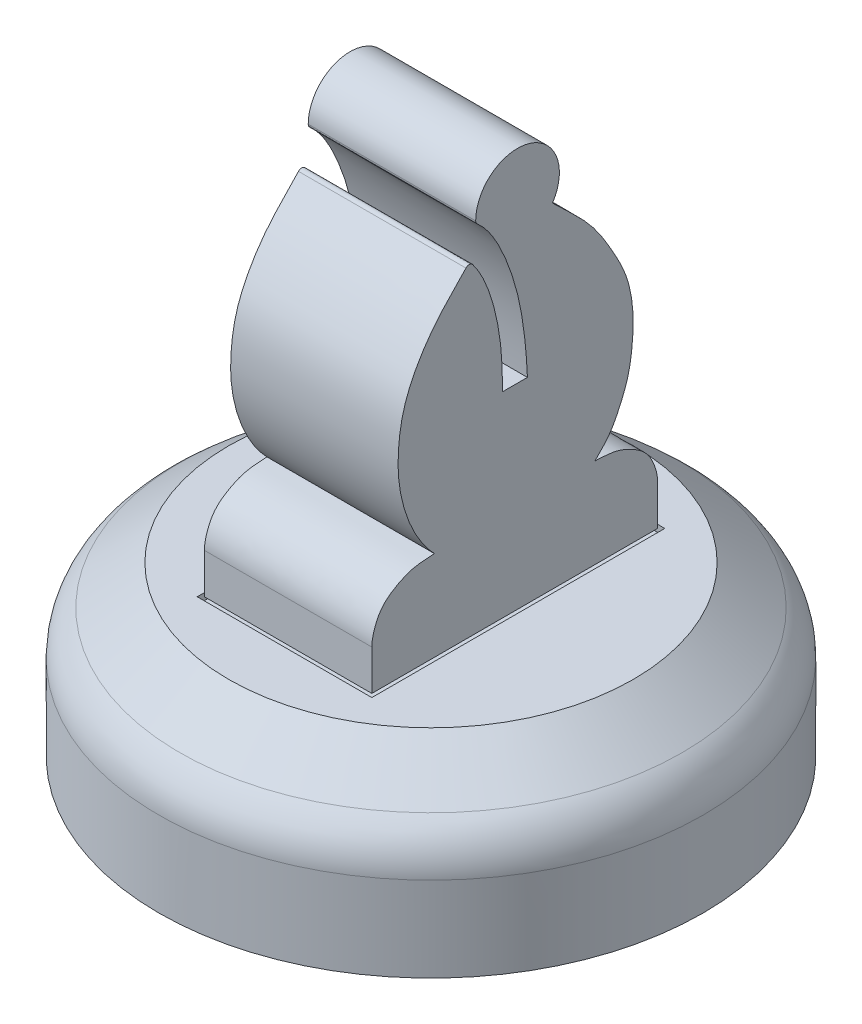
ISO-10303-21;
HEADER;
FILE_DESCRIPTION(('STEP AP214'),'2;1');
FILE_NAME('part.step','',(''),(''),'','','');
FILE_SCHEMA(('AUTOMOTIVE_DESIGN { 1 0 10303 214 1 1 1 1 }'));
ENDSEC;
DATA;
#1=APPLICATION_CONTEXT('core data for automotive mechanical design processes');
#2=APPLICATION_PROTOCOL_DEFINITION('international standard','automotive_design',2000,#1);
#3=PRODUCT_CONTEXT('',#1,'mechanical');
#4=PRODUCT('Part','Part','',(#3));
#5=PRODUCT_RELATED_PRODUCT_CATEGORY('part','',(#4));
#6=PRODUCT_DEFINITION_FORMATION('','',#4);
#7=PRODUCT_DEFINITION_CONTEXT('part definition',#1,'design');
#8=PRODUCT_DEFINITION('design','',#6,#7);
#9=PRODUCT_DEFINITION_SHAPE('','',#8);
#10=(LENGTH_UNIT() NAMED_UNIT(*) SI_UNIT(.MILLI.,.METRE.));
#11=(NAMED_UNIT(*) PLANE_ANGLE_UNIT() SI_UNIT($,.RADIAN.));
#12=(NAMED_UNIT(*) SI_UNIT($,.STERADIAN.) SOLID_ANGLE_UNIT());
#13=UNCERTAINTY_MEASURE_WITH_UNIT(LENGTH_MEASURE(1.E-05),#10,'distance_accuracy_value','');
#14=(GEOMETRIC_REPRESENTATION_CONTEXT(3) GLOBAL_UNCERTAINTY_ASSIGNED_CONTEXT((#13)) GLOBAL_UNIT_ASSIGNED_CONTEXT((#10,
#11,#12)) REPRESENTATION_CONTEXT('',''));
#15=CARTESIAN_POINT('',(0.,0.,0.));
#16=DIRECTION('',(0.,0.,1.));
#17=DIRECTION('',(1.,0.,0.));
#18=AXIS2_PLACEMENT_3D('',#15,#16,#17);
#19=CARTESIAN_POINT('',(4.7625,9.525,-8.128));
#20=DIRECTION('',(0.,0.,1.));
#21=DIRECTION('',(1.,0.,0.));
#22=AXIS2_PLACEMENT_3D('',#19,#20,#21);
#23=PLANE('',#22);
#24=DIRECTION('',(0.,1.,0.));
#25=VECTOR('',#24,1.);
#26=CARTESIAN_POINT('',(-4.7625,9.525,-8.128));
#27=LINE('',#26,#25);
#28=CARTESIAN_POINT('',(-4.7625,9.525,-8.128));
#29=VERTEX_POINT('',#28);
#30=CARTESIAN_POINT('',(-4.7625,11.811,-8.128));
#31=VERTEX_POINT('',#30);
#32=EDGE_CURVE('E165',#29,#31,#27,.T.);
#33=ORIENTED_EDGE('',*,*,#32,.T.);
#34=DIRECTION('',(-1.,0.,0.));
#35=VECTOR('',#34,1.);
#36=CARTESIAN_POINT('',(4.7625,11.811,-8.128));
#37=LINE('',#36,#35);
#38=CARTESIAN_POINT('',(4.7625,11.811,-8.128));
#39=VERTEX_POINT('',#38);
#40=EDGE_CURVE('E146',#39,#31,#37,.T.);
#41=ORIENTED_EDGE('',*,*,#40,.F.);
#42=DIRECTION('',(0.,1.,0.));
#43=VECTOR('',#42,1.);
#44=CARTESIAN_POINT('',(4.7625,9.525,-8.128));
#45=LINE('',#44,#43);
#46=CARTESIAN_POINT('',(4.7625,9.525,-8.128));
#47=VERTEX_POINT('',#46);
#48=EDGE_CURVE('E152',#47,#39,#45,.T.);
#49=ORIENTED_EDGE('',*,*,#48,.F.);
#50=DIRECTION('',(-1.,0.,0.));
#51=VECTOR('',#50,1.);
#52=CARTESIAN_POINT('',(4.7625,9.525,-8.128));
#53=LINE('',#52,#51);
#54=EDGE_CURVE('E221',#47,#29,#53,.T.);
#55=ORIENTED_EDGE('',*,*,#54,.T.);
#56=EDGE_LOOP('',(#33,#41,#49,#55));
#57=FACE_BOUND('',#56,.T.);
#58=ADVANCED_FACE('F47',(#57),#23,.F.);
#59=CARTESIAN_POINT('',(4.7625,11.811,-8.128));
#60=CARTESIAN_POINT('',(4.7625,11.9648529617268,-8.128));
#61=CARTESIAN_POINT('',(4.7625,12.2878135434092,-8.08807965528889));
#62=CARTESIAN_POINT('',(4.7625,12.8218163153824,-7.92101324475147));
#63=CARTESIAN_POINT('',(4.7625,13.3674317761448,-7.66053880134677));
#64=CARTESIAN_POINT('',(4.7625,13.799641497639,-7.23725813915289));
#65=CARTESIAN_POINT('',(4.7625,14.0934378926724,-6.78722135468409));
#66=CARTESIAN_POINT('',(4.7625,14.317391583893,-6.35918909408839));
#67=CARTESIAN_POINT('',(4.7625,14.5920455743741,-5.63117445508961));
#68=CARTESIAN_POINT('',(4.7625,14.6060569562118,-5.01856318897145));
#69=CARTESIAN_POINT('',(4.7625,14.6331337360769,-4.56746652672812));
#70=B_SPLINE_CURVE_WITH_KNOTS('',3,(#59,#60,#61,#62,#63,#64,#65,#66,#67,#68,#69),.UNSPECIFIED.,
.F.,.F.,(4,1,1,1,1,1,1,1,4),(0.,0.0918219891714551,0.189225593097986,0.331099538986127,
0.444001015865927,0.541829554256301,0.647961242520926,0.729130912459702,1.),.UNSPECIFIED.);
#71=DIRECTION('',(-1.,0.,0.));
#72=VECTOR('',#71,1.);
#73=SURFACE_OF_LINEAR_EXTRUSION('',#70,#72);
#74=CARTESIAN_POINT('',(-4.7625,11.811,-8.128));
#75=CARTESIAN_POINT('',(-4.7625,11.9648529617268,-8.128));
#76=CARTESIAN_POINT('',(-4.7625,12.2878135434092,-8.08807965528889));
#77=CARTESIAN_POINT('',(-4.7625,12.8218163153824,-7.92101324475147));
#78=CARTESIAN_POINT('',(-4.7625,13.3674317761448,-7.66053880134677));
#79=CARTESIAN_POINT('',(-4.7625,13.799641497639,-7.23725813915289));
#80=CARTESIAN_POINT('',(-4.7625,14.0934378926724,-6.78722135468409));
#81=CARTESIAN_POINT('',(-4.7625,14.317391583893,-6.35918909408839));
#82=CARTESIAN_POINT('',(-4.7625,14.5920455743741,-5.63117445508961));
#83=CARTESIAN_POINT('',(-4.7625,14.6060569562118,-5.01856318897145));
#84=CARTESIAN_POINT('',(-4.7625,14.6331337360769,-4.56746652672812));
#85=B_SPLINE_CURVE_WITH_KNOTS('',3,(#74,#75,#76,#77,#78,#79,#80,#81,#82,#83,#84),.UNSPECIFIED.,
.F.,.F.,(4,1,1,1,1,1,1,1,4),(0.,0.0918219891714551,0.189225593097986,0.331099538986127,
0.444001015865927,0.541829554256301,0.647961242520926,0.729130912459702,1.),.UNSPECIFIED.);
#86=CARTESIAN_POINT('',(-4.7625,14.6331337360769,-4.56746652672812));
#87=VERTEX_POINT('',#86);
#88=EDGE_CURVE('E252',#31,#87,#85,.T.);
#89=ORIENTED_EDGE('',*,*,#88,.T.);
#90=DIRECTION('',(-1.,0.,0.));
#91=VECTOR('',#90,1.);
#92=CARTESIAN_POINT('',(4.7625,14.6331337360769,-4.56746652672812));
#93=LINE('',#92,#91);
#94=CARTESIAN_POINT('',(4.7625,14.6331337360769,-4.56746652672812));
#95=VERTEX_POINT('',#94);
#96=EDGE_CURVE('E149',#95,#87,#93,.T.);
#97=ORIENTED_EDGE('',*,*,#96,.F.);
#98=EDGE_CURVE('E142',#39,#95,#70,.T.);
#99=ORIENTED_EDGE('',*,*,#98,.F.);
#100=ORIENTED_EDGE('',*,*,#40,.T.);
#101=EDGE_LOOP('',(#89,#97,#99,#100));
#102=FACE_BOUND('',#101,.T.);
#103=ADVANCED_FACE('F144',(#102),#73,.F.);
#104=CARTESIAN_POINT('',(4.7625,14.6331337360769,-4.56746652672812));
#105=CARTESIAN_POINT('',(4.7625,14.9349830243827,-4.86533100098625));
#106=CARTESIAN_POINT('',(4.7625,15.4744064075202,-5.40910627002341));
#107=CARTESIAN_POINT('',(4.7625,16.573568683483,-5.9692610623002));
#108=CARTESIAN_POINT('',(4.7625,17.7289929200996,-6.45737455776365));
#109=CARTESIAN_POINT('',(4.7625,19.4447141491921,-6.74461953909816));
#110=CARTESIAN_POINT('',(4.7625,21.198431759257,-6.78563688970766));
#111=CARTESIAN_POINT('',(4.7625,23.0510264242443,-6.33807292479153));
#112=CARTESIAN_POINT('',(4.7625,24.2933114011134,-5.66876530751379));
#113=CARTESIAN_POINT('',(4.7625,25.5054264924175,-4.96558034911564));
#114=CARTESIAN_POINT('',(4.7625,26.4193690280854,-4.30149584078117));
#115=CARTESIAN_POINT('',(4.7625,27.4533483292314,-3.30531163121623));
#116=CARTESIAN_POINT('',(4.7625,28.0974874009055,-2.59854807637218));
#117=CARTESIAN_POINT('',(4.7625,28.5424878525264,-2.14725480231107));
#118=B_SPLINE_CURVE_WITH_KNOTS('',3,(#104,#105,#106,#107,#108,#109,#110,#111,#112,#113,#114,
#115,#116,#117),.UNSPECIFIED.,.F.,.F.,(4,1,1,1,1,1,1,1,1,1,1,4),(0.,0.080158755931527,
0.141654265423259,0.230515183976744,0.314788545895022,0.467006334679373,0.556741952067475,
0.669627033261549,0.730468918128093,0.820323985734543,0.880912548054554,1.),.UNSPECIFIED.);
#119=DIRECTION('',(-1.,0.,0.));
#120=VECTOR('',#119,1.);
#121=SURFACE_OF_LINEAR_EXTRUSION('',#118,#120);
#122=CARTESIAN_POINT('',(-4.7625,14.6331337360769,-4.56746652672812));
#123=CARTESIAN_POINT('',(-4.7625,14.9349830243827,-4.86533100098625));
#124=CARTESIAN_POINT('',(-4.7625,15.4744064075202,-5.40910627002341));
#125=CARTESIAN_POINT('',(-4.7625,16.573568683483,-5.9692610623002));
#126=CARTESIAN_POINT('',(-4.7625,17.7289929200996,-6.45737455776365));
#127=CARTESIAN_POINT('',(-4.7625,19.4447141491921,-6.74461953909816));
#128=CARTESIAN_POINT('',(-4.7625,21.198431759257,-6.78563688970766));
#129=CARTESIAN_POINT('',(-4.7625,23.0510264242443,-6.33807292479153));
#130=CARTESIAN_POINT('',(-4.7625,24.2933114011134,-5.66876530751379));
#131=CARTESIAN_POINT('',(-4.7625,25.5054264924175,-4.96558034911564));
#132=CARTESIAN_POINT('',(-4.7625,26.4193690280854,-4.30149584078117));
#133=CARTESIAN_POINT('',(-4.7625,27.4533483292314,-3.30531163121623));
#134=CARTESIAN_POINT('',(-4.7625,28.0974874009055,-2.59854807637218));
#135=CARTESIAN_POINT('',(-4.7625,28.5424878525264,-2.14725480231107));
#136=B_SPLINE_CURVE_WITH_KNOTS('',3,(#122,#123,#124,#125,#126,#127,#128,#129,#130,#131,#132,
#133,#134,#135),.UNSPECIFIED.,.F.,.F.,(4,1,1,1,1,1,1,1,1,1,1,4),(0.,0.080158755931527,
0.141654265423259,0.230515183976744,0.314788545895022,0.467006334679373,0.556741952067475,
0.669627033261549,0.730468918128093,0.820323985734543,0.880912548054554,1.),.UNSPECIFIED.);
#137=CARTESIAN_POINT('',(-4.7625,28.5424878525264,-2.14725480231107));
#138=VERTEX_POINT('',#137);
#139=EDGE_CURVE('E248',#87,#138,#136,.T.);
#140=ORIENTED_EDGE('',*,*,#139,.T.);
#141=DIRECTION('',(-1.,0.,0.));
#142=VECTOR('',#141,1.);
#143=CARTESIAN_POINT('',(4.7625,28.5424878525264,-2.14725480231107));
#144=LINE('',#143,#142);
#145=CARTESIAN_POINT('',(4.7625,28.5424878525264,-2.14725480231107));
#146=VERTEX_POINT('',#145);
#147=EDGE_CURVE('E171',#146,#138,#144,.T.);
#148=ORIENTED_EDGE('',*,*,#147,.F.);
#149=EDGE_CURVE('E151',#95,#146,#118,.T.);
#150=ORIENTED_EDGE('',*,*,#149,.F.);
#151=ORIENTED_EDGE('',*,*,#96,.T.);
#152=EDGE_LOOP('',(#140,#148,#150,#151));
#153=FACE_BOUND('',#152,.T.);
#154=ADVANCED_FACE('F316',(#153),#121,.F.);
#155=CARTESIAN_POINT('',(4.7625,29.852343040966,-0.159535802175067));
#156=DIRECTION('',(-1.,0.,0.));
#157=DIRECTION('',(0.,0.,1.));
#158=AXIS2_PLACEMENT_3D('',#155,#156,#157);
#159=CYLINDRICAL_SURFACE('',#158,2.38049310819919);
#160=CARTESIAN_POINT('',(-4.7625,29.852343040966,-0.159535802175067));
#161=DIRECTION('',(1.,0.,0.));
#162=DIRECTION('',(0.,0.,-1.));
#163=AXIS2_PLACEMENT_3D('',#160,#161,#162);
#164=CIRCLE('',#163,2.38049310819919);
#165=CARTESIAN_POINT('',(-4.7625,29.8500654973485,2.22095621650068));
#166=VERTEX_POINT('',#165);
#167=EDGE_CURVE('E243',#138,#166,#164,.T.);
#168=ORIENTED_EDGE('',*,*,#167,.T.);
#169=DIRECTION('',(-1.,0.,0.));
#170=VECTOR('',#169,1.);
#171=CARTESIAN_POINT('',(4.7625,29.8500654973485,2.22095621650068));
#172=LINE('',#171,#170);
#173=CARTESIAN_POINT('',(4.7625,29.8500654973485,2.22095621650068));
#174=VERTEX_POINT('',#173);
#175=EDGE_CURVE('E178',#166,#174,#172,.F.);
#176=ORIENTED_EDGE('',*,*,#175,.T.);
#177=CARTESIAN_POINT('',(4.7625,29.852343040966,-0.159535802175067));
#178=DIRECTION('',(1.,0.,0.));
#179=DIRECTION('',(0.,0.,-1.));
#180=AXIS2_PLACEMENT_3D('',#177,#178,#179);
#181=CIRCLE('',#180,2.38049310819919);
#182=EDGE_CURVE('E245',#146,#174,#181,.T.);
#183=ORIENTED_EDGE('',*,*,#182,.F.);
#184=ORIENTED_EDGE('',*,*,#147,.T.);
#185=EDGE_LOOP('',(#168,#176,#183,#184));
#186=FACE_BOUND('',#185,.T.);
#187=ADVANCED_FACE('F242',(#186),#159,.T.);
#188=CARTESIAN_POINT('',(4.7625,29.730237714043,2.21782360004431));
#189=CARTESIAN_POINT('',(4.7625,29.238401482132,1.62152233036171));
#190=CARTESIAN_POINT('',(4.7625,28.2444473462936,0.995355422394157));
#191=CARTESIAN_POINT('',(4.7625,26.7034487398556,0.327091026965975));
#192=CARTESIAN_POINT('',(4.7625,24.3370861756788,-0.440040307635785));
#193=CARTESIAN_POINT('',(4.7625,22.2279160020844,-0.650497255560858));
#194=CARTESIAN_POINT('',(4.7625,20.6684063251512,-0.721519657970217));
#195=B_SPLINE_CURVE_WITH_KNOTS('',3,(#188,#189,#190,#191,#192,#193,#194),.UNSPECIFIED.,.F.,.F.,
(4,1,1,1,4),(0.,0.236294144968527,0.354063326051505,0.517816971461855,1.),.UNSPECIFIED.);
#196=DIRECTION('',(-1.,0.,0.));
#197=VECTOR('',#196,1.);
#198=SURFACE_OF_LINEAR_EXTRUSION('',#195,#197);
#199=CARTESIAN_POINT('',(4.7625,29.6592464873384,2.13432210736513));
#200=VERTEX_POINT('',#199);
#201=CARTESIAN_POINT('',(4.7625,20.6684063251512,-0.721519657970217));
#202=VERTEX_POINT('',#201);
#203=EDGE_CURVE('E274',#200,#202,#195,.T.);
#204=ORIENTED_EDGE('',*,*,#203,.F.);
#205=DIRECTION('',(-1.,0.,0.));
#206=VECTOR('',#205,1.);
#207=CARTESIAN_POINT('',(4.7625,29.6592464873384,2.13432210736513));
#208=LINE('',#207,#206);
#209=CARTESIAN_POINT('',(-4.7625,29.6592464873384,2.13432210736513));
#210=VERTEX_POINT('',#209);
#211=EDGE_CURVE('E166',#200,#210,#208,.T.);
#212=ORIENTED_EDGE('',*,*,#211,.T.);
#213=CARTESIAN_POINT('',(-4.7625,29.730237714043,2.21782360004431));
#214=CARTESIAN_POINT('',(-4.7625,29.238401482132,1.62152233036171));
#215=CARTESIAN_POINT('',(-4.7625,28.2444473462936,0.995355422394157));
#216=CARTESIAN_POINT('',(-4.7625,26.7034487398556,0.327091026965975));
#217=CARTESIAN_POINT('',(-4.7625,24.3370861756788,-0.440040307635785));
#218=CARTESIAN_POINT('',(-4.7625,22.2279160020844,-0.650497255560858));
#219=CARTESIAN_POINT('',(-4.7625,20.6684063251512,-0.721519657970217));
#220=B_SPLINE_CURVE_WITH_KNOTS('',3,(#213,#214,#215,#216,#217,#218,#219),.UNSPECIFIED.,.F.,.F.,
(4,1,1,1,4),(0.,0.236294144968527,0.354063326051505,0.517816971461855,1.),.UNSPECIFIED.);
#221=CARTESIAN_POINT('',(-4.7625,20.6684063251512,-0.721519657970217));
#222=VERTEX_POINT('',#221);
#223=EDGE_CURVE('E249',#210,#222,#220,.T.);
#224=ORIENTED_EDGE('',*,*,#223,.T.);
#225=DIRECTION('',(-1.,0.,0.));
#226=VECTOR('',#225,1.);
#227=CARTESIAN_POINT('',(4.7625,20.6684063251512,-0.721519657970217));
#228=LINE('',#227,#226);
#229=EDGE_CURVE('E234',#202,#222,#228,.T.);
#230=ORIENTED_EDGE('',*,*,#229,.F.);
#231=EDGE_LOOP('',(#204,#212,#224,#230));
#232=FACE_BOUND('',#231,.T.);
#233=ADVANCED_FACE('F294',(#232),#198,.F.);
#234=CARTESIAN_POINT('',(4.7625,20.6684063251512,-0.721519657970217));
#235=DIRECTION('',(0.,-1.,0.));
#236=DIRECTION('',(0.,0.,-1.));
#237=AXIS2_PLACEMENT_3D('',#234,#235,#236);
#238=PLANE('',#237);
#239=DIRECTION('',(0.,0.,1.));
#240=VECTOR('',#239,1.);
#241=CARTESIAN_POINT('',(-4.7625,20.6684063251512,-0.721519657970217));
#242=LINE('',#241,#240);
#243=CARTESIAN_POINT('',(-4.7625,20.6684063251512,0.702792016101595));
#244=VERTEX_POINT('',#243);
#245=EDGE_CURVE('E203',#222,#244,#242,.T.);
#246=ORIENTED_EDGE('',*,*,#245,.T.);
#247=DIRECTION('',(-1.,0.,0.));
#248=VECTOR('',#247,1.);
#249=CARTESIAN_POINT('',(4.7625,20.6684063251512,0.702792016101595));
#250=LINE('',#249,#248);
#251=CARTESIAN_POINT('',(4.7625,20.6684063251512,0.702792016101595));
#252=VERTEX_POINT('',#251);
#253=EDGE_CURVE('E231',#252,#244,#250,.T.);
#254=ORIENTED_EDGE('',*,*,#253,.F.);
#255=DIRECTION('',(0.,0.,1.));
#256=VECTOR('',#255,1.);
#257=CARTESIAN_POINT('',(4.7625,20.6684063251512,-0.721519657970217));
#258=LINE('',#257,#256);
#259=EDGE_CURVE('E270',#202,#252,#258,.T.);
#260=ORIENTED_EDGE('',*,*,#259,.F.);
#261=ORIENTED_EDGE('',*,*,#229,.T.);
#262=EDGE_LOOP('',(#246,#254,#260,#261));
#263=FACE_BOUND('',#262,.T.);
#264=ADVANCED_FACE('F265',(#263),#238,.F.);
#265=CARTESIAN_POINT('',(4.7625,20.6684063251512,0.702792016101595));
#266=CARTESIAN_POINT('',(4.7625,21.8950133551458,0.674457314630429));
#267=CARTESIAN_POINT('',(4.7625,23.7052639430097,0.802393308060726));
#268=CARTESIAN_POINT('',(4.7625,26.1981211626975,1.47058714455235));
#269=CARTESIAN_POINT('',(4.7625,27.4201510607422,2.06456945847046));
#270=CARTESIAN_POINT('',(4.7625,28.0112149974639,2.57714536085349));
#271=B_SPLINE_CURVE_WITH_KNOTS('',3,(#265,#266,#267,#268,#269,#270),.UNSPECIFIED.,.F.,.F.,(4,1,
1,4),(0.,0.477136469895854,0.699696539150446,1.),.UNSPECIFIED.);
#272=DIRECTION('',(-1.,0.,0.));
#273=VECTOR('',#272,1.);
#274=SURFACE_OF_LINEAR_EXTRUSION('',#271,#273);
#275=CARTESIAN_POINT('',(-4.7625,20.6684063251512,0.702792016101595));
#276=CARTESIAN_POINT('',(-4.7625,21.8950133551458,0.674457314630429));
#277=CARTESIAN_POINT('',(-4.7625,23.7052639430097,0.802393308060726));
#278=CARTESIAN_POINT('',(-4.7625,26.1981211626975,1.47058714455235));
#279=CARTESIAN_POINT('',(-4.7625,27.4201510607422,2.06456945847046));
#280=CARTESIAN_POINT('',(-4.7625,28.0112149974639,2.57714536085349));
#281=B_SPLINE_CURVE_WITH_KNOTS('',3,(#275,#276,#277,#278,#279,#280),.UNSPECIFIED.,.F.,.F.,(4,1,
1,4),(0.,0.477136469895854,0.699696539150446,1.),.UNSPECIFIED.);
#282=CARTESIAN_POINT('',(-4.7625,27.7813951862263,2.39039312236621));
#283=VERTEX_POINT('',#282);
#284=EDGE_CURVE('E199',#244,#283,#281,.T.);
#285=ORIENTED_EDGE('',*,*,#284,.T.);
#286=DIRECTION('',(-1.,0.,0.));
#287=VECTOR('',#286,1.);
#288=CARTESIAN_POINT('',(-4.7625,27.7813951862263,2.39039312236621));
#289=LINE('',#288,#287);
#290=CARTESIAN_POINT('',(4.7625,27.7813951862263,2.39039312236621));
#291=VERTEX_POINT('',#290);
#292=EDGE_CURVE('E12',#283,#291,#289,.F.);
#293=ORIENTED_EDGE('',*,*,#292,.T.);
#294=EDGE_CURVE('E269',#252,#291,#271,.T.);
#295=ORIENTED_EDGE('',*,*,#294,.F.);
#296=ORIENTED_EDGE('',*,*,#253,.T.);
#297=EDGE_LOOP('',(#285,#293,#295,#296));
#298=FACE_BOUND('',#297,.T.);
#299=ADVANCED_FACE('F268',(#298),#274,.F.);
#300=CARTESIAN_POINT('',(4.7625,28.0112149974639,2.57714536085349));
#301=CARTESIAN_POINT('',(4.7625,27.3022513570063,3.24909089370737));
#302=CARTESIAN_POINT('',(4.7625,26.1278784839257,4.46862182876325));
#303=CARTESIAN_POINT('',(4.7625,24.3169839566156,5.64843107555805));
#304=CARTESIAN_POINT('',(4.7625,22.7376320880144,6.33171461445433));
#305=CARTESIAN_POINT('',(4.7625,21.1020927305089,6.63432069224891));
#306=CARTESIAN_POINT('',(4.7625,19.0260553490712,6.67266630535078));
#307=CARTESIAN_POINT('',(4.7625,16.7048464760161,6.06354786788394));
#308=CARTESIAN_POINT('',(4.7625,15.2380506760428,5.15163151457678));
#309=CARTESIAN_POINT('',(4.7625,14.6331337360769,4.56746652672812));
#310=B_SPLINE_CURVE_WITH_KNOTS('',3,(#300,#301,#302,#303,#304,#305,#306,#307,#308,#309),
.UNSPECIFIED.,.F.,.F.,(4,1,1,1,1,1,1,4),(0.,0.193953117282659,0.333677509566072,
0.425378510717123,0.533262363963971,0.661023727532061,0.834598476190516,1.),.UNSPECIFIED.);
#311=DIRECTION('',(-1.,0.,0.));
#312=VECTOR('',#311,1.);
#313=SURFACE_OF_LINEAR_EXTRUSION('',#310,#312);
#314=CARTESIAN_POINT('',(4.7625,27.8035485657613,2.77552429988209));
#315=VERTEX_POINT('',#314);
#316=CARTESIAN_POINT('',(4.7625,14.6331337360769,4.56746652672812));
#317=VERTEX_POINT('',#316);
#318=EDGE_CURVE('E190',#315,#317,#310,.T.);
#319=ORIENTED_EDGE('',*,*,#318,.F.);
#320=DIRECTION('',(-1.,0.,0.));
#321=VECTOR('',#320,1.);
#322=CARTESIAN_POINT('',(4.7625,27.8035485657613,2.77552429988209));
#323=LINE('',#322,#321);
#324=CARTESIAN_POINT('',(-4.7625,27.8035485657613,2.77552429988209));
#325=VERTEX_POINT('',#324);
#326=EDGE_CURVE('E55',#315,#325,#323,.T.);
#327=ORIENTED_EDGE('',*,*,#326,.T.);
#328=CARTESIAN_POINT('',(-4.7625,28.0112149974639,2.57714536085349));
#329=CARTESIAN_POINT('',(-4.7625,27.3022513570063,3.24909089370737));
#330=CARTESIAN_POINT('',(-4.7625,26.1278784839257,4.46862182876325));
#331=CARTESIAN_POINT('',(-4.7625,24.3169839566156,5.64843107555805));
#332=CARTESIAN_POINT('',(-4.7625,22.7376320880144,6.33171461445433));
#333=CARTESIAN_POINT('',(-4.7625,21.1020927305089,6.63432069224891));
#334=CARTESIAN_POINT('',(-4.7625,19.0260553490712,6.67266630535078));
#335=CARTESIAN_POINT('',(-4.7625,16.7048464760161,6.06354786788394));
#336=CARTESIAN_POINT('',(-4.7625,15.2380506760428,5.15163151457678));
#337=CARTESIAN_POINT('',(-4.7625,14.6331337360769,4.56746652672812));
#338=B_SPLINE_CURVE_WITH_KNOTS('',3,(#328,#329,#330,#331,#332,#333,#334,#335,#336,#337),
.UNSPECIFIED.,.F.,.F.,(4,1,1,1,1,1,1,4),(0.,0.193953117282659,0.333677509566072,
0.425378510717123,0.533262363963971,0.661023727532061,0.834598476190516,1.),.UNSPECIFIED.);
#339=CARTESIAN_POINT('',(-4.7625,14.6331337360769,4.56746652672812));
#340=VERTEX_POINT('',#339);
#341=EDGE_CURVE('E188',#325,#340,#338,.T.);
#342=ORIENTED_EDGE('',*,*,#341,.T.);
#343=DIRECTION('',(-1.,0.,0.));
#344=VECTOR('',#343,1.);
#345=CARTESIAN_POINT('',(4.7625,14.6331337360769,4.56746652672812));
#346=LINE('',#345,#344);
#347=EDGE_CURVE('E229',#317,#340,#346,.T.);
#348=ORIENTED_EDGE('',*,*,#347,.F.);
#349=EDGE_LOOP('',(#319,#327,#342,#348));
#350=FACE_BOUND('',#349,.T.);
#351=ADVANCED_FACE('F186',(#350),#313,.F.);
#352=CARTESIAN_POINT('',(4.7625,14.6331337360769,4.56746652672812));
#353=CARTESIAN_POINT('',(4.7625,14.6060569562118,5.01856318897145));
#354=CARTESIAN_POINT('',(4.7625,14.5920455743741,5.63117445508961));
#355=CARTESIAN_POINT('',(4.7625,14.317391583893,6.35918909408839));
#356=CARTESIAN_POINT('',(4.7625,14.0934378926724,6.78722135468409));
#357=CARTESIAN_POINT('',(4.7625,13.799641497639,7.23725813915289));
#358=CARTESIAN_POINT('',(4.7625,13.3674317761448,7.66053880134677));
#359=CARTESIAN_POINT('',(4.7625,12.8218163153824,7.92101324475147));
#360=CARTESIAN_POINT('',(4.7625,12.2878135434092,8.08807965528889));
#361=CARTESIAN_POINT('',(4.7625,11.9648529617268,8.128));
#362=CARTESIAN_POINT('',(4.7625,11.811,8.128));
#363=B_SPLINE_CURVE_WITH_KNOTS('',3,(#352,#353,#354,#355,#356,#357,#358,#359,#360,#361,#362),
.UNSPECIFIED.,.F.,.F.,(4,1,1,1,1,1,1,1,4),(0.,0.270869087540298,0.352038757479074,
0.458170445743699,0.555998984134073,0.668900461013873,0.810774406902014,0.908178010828545,1.),.UNSPECIFIED.);
#364=DIRECTION('',(-1.,0.,0.));
#365=VECTOR('',#364,1.);
#366=SURFACE_OF_LINEAR_EXTRUSION('',#363,#365);
#367=CARTESIAN_POINT('',(-4.7625,14.6331337360769,4.56746652672812));
#368=CARTESIAN_POINT('',(-4.7625,14.6060569562118,5.01856318897145));
#369=CARTESIAN_POINT('',(-4.7625,14.5920455743741,5.63117445508961));
#370=CARTESIAN_POINT('',(-4.7625,14.317391583893,6.35918909408839));
#371=CARTESIAN_POINT('',(-4.7625,14.0934378926724,6.78722135468409));
#372=CARTESIAN_POINT('',(-4.7625,13.799641497639,7.23725813915289));
#373=CARTESIAN_POINT('',(-4.7625,13.3674317761448,7.66053880134677));
#374=CARTESIAN_POINT('',(-4.7625,12.8218163153824,7.92101324475147));
#375=CARTESIAN_POINT('',(-4.7625,12.2878135434092,8.08807965528889));
#376=CARTESIAN_POINT('',(-4.7625,11.9648529617268,8.128));
#377=CARTESIAN_POINT('',(-4.7625,11.811,8.128));
#378=B_SPLINE_CURVE_WITH_KNOTS('',3,(#367,#368,#369,#370,#371,#372,#373,#374,#375,#376,#377),
.UNSPECIFIED.,.F.,.F.,(4,1,1,1,1,1,1,1,4),(0.,0.270869087540298,0.352038757479074,
0.458170445743699,0.555998984134073,0.668900461013873,0.810774406902014,0.908178010828545,1.),.UNSPECIFIED.);
#379=CARTESIAN_POINT('',(-4.7625,11.811,8.128));
#380=VERTEX_POINT('',#379);
#381=EDGE_CURVE('E198',#340,#380,#378,.T.);
#382=ORIENTED_EDGE('',*,*,#381,.T.);
#383=DIRECTION('',(-1.,0.,0.));
#384=VECTOR('',#383,1.);
#385=CARTESIAN_POINT('',(4.7625,11.811,8.128));
#386=LINE('',#385,#384);
#387=CARTESIAN_POINT('',(4.7625,11.811,8.128));
#388=VERTEX_POINT('',#387);
#389=EDGE_CURVE('E226',#388,#380,#386,.T.);
#390=ORIENTED_EDGE('',*,*,#389,.F.);
#391=EDGE_CURVE('E272',#317,#388,#363,.T.);
#392=ORIENTED_EDGE('',*,*,#391,.F.);
#393=ORIENTED_EDGE('',*,*,#347,.T.);
#394=EDGE_LOOP('',(#382,#390,#392,#393));
#395=FACE_BOUND('',#394,.T.);
#396=ADVANCED_FACE('F344',(#395),#366,.F.);
#397=CARTESIAN_POINT('',(4.7625,9.525,8.128));
#398=DIRECTION('',(0.,0.,-1.));
#399=DIRECTION('',(-1.,0.,0.));
#400=AXIS2_PLACEMENT_3D('',#397,#398,#399);
#401=PLANE('',#400);
#402=DIRECTION('',(0.,-1.,0.));
#403=VECTOR('',#402,1.);
#404=CARTESIAN_POINT('',(-4.7625,9.525,8.128));
#405=LINE('',#404,#403);
#406=CARTESIAN_POINT('',(-4.7625,9.525,8.128));
#407=VERTEX_POINT('',#406);
#408=EDGE_CURVE('E201',#380,#407,#405,.T.);
#409=ORIENTED_EDGE('',*,*,#408,.T.);
#410=DIRECTION('',(-1.,0.,0.));
#411=VECTOR('',#410,1.);
#412=CARTESIAN_POINT('',(4.7625,9.525,8.128));
#413=LINE('',#412,#411);
#414=CARTESIAN_POINT('',(4.7625,9.525,8.128));
#415=VERTEX_POINT('',#414);
#416=EDGE_CURVE('E223',#415,#407,#413,.T.);
#417=ORIENTED_EDGE('',*,*,#416,.F.);
#418=DIRECTION('',(0.,-1.,0.));
#419=VECTOR('',#418,1.);
#420=CARTESIAN_POINT('',(4.7625,9.525,8.128));
#421=LINE('',#420,#419);
#422=EDGE_CURVE('E352',#388,#415,#421,.T.);
#423=ORIENTED_EDGE('',*,*,#422,.F.);
#424=ORIENTED_EDGE('',*,*,#389,.T.);
#425=EDGE_LOOP('',(#409,#417,#423,#424));
#426=FACE_BOUND('',#425,.T.);
#427=ADVANCED_FACE('F341',(#426),#401,.F.);
#428=CARTESIAN_POINT('',(4.7625,9.525,-8.128));
#429=DIRECTION('',(0.,1.,0.));
#430=DIRECTION('',(0.,0.,1.));
#431=AXIS2_PLACEMENT_3D('',#428,#429,#430);
#432=PLANE('',#431);
#433=DIRECTION('',(0.,0.,-1.));
#434=VECTOR('',#433,1.);
#435=CARTESIAN_POINT('',(-4.7625,9.525,-8.128));
#436=LINE('',#435,#434);
#437=EDGE_CURVE('E162',#407,#29,#436,.T.);
#438=ORIENTED_EDGE('',*,*,#437,.T.);
#439=ORIENTED_EDGE('',*,*,#54,.F.);
#440=DIRECTION('',(0.,0.,-1.));
#441=VECTOR('',#440,1.);
#442=CARTESIAN_POINT('',(4.7625,9.525,-8.128));
#443=LINE('',#442,#441);
#444=EDGE_CURVE('E158',#415,#47,#443,.T.);
#445=ORIENTED_EDGE('',*,*,#444,.F.);
#446=ORIENTED_EDGE('',*,*,#416,.T.);
#447=EDGE_LOOP('',(#438,#439,#445,#446));
#448=FACE_BOUND('',#447,.T.);
#449=ADVANCED_FACE('F336',(#448),#432,.F.);
#450=CARTESIAN_POINT('',(4.7625,13.9670775863561,-6.97575263705773));
#451=DIRECTION('',(-1.,0.,0.));
#452=DIRECTION('',(0.,0.,1.));
#453=AXIS2_PLACEMENT_3D('',#450,#451,#452);
#454=PLANE('',#453);
#455=ORIENTED_EDGE('',*,*,#182,.T.);
#456=CARTESIAN_POINT('',(4.7625,29.8503085125779,1.96695633275346));
#457=DIRECTION('',(-1.,0.,0.));
#458=DIRECTION('',(0.,0.,1.));
#459=AXIS2_PLACEMENT_3D('',#456,#457,#458);
#460=CIRCLE('',#459,0.254);
#461=EDGE_CURVE('E181',#174,#200,#460,.F.);
#462=ORIENTED_EDGE('',*,*,#461,.T.);
#463=ORIENTED_EDGE('',*,*,#203,.T.);
#464=ORIENTED_EDGE('',*,*,#259,.T.);
#465=ORIENTED_EDGE('',*,*,#294,.T.);
#466=CARTESIAN_POINT('',(4.7625,27.6274817813122,2.59244921306315));
#467=DIRECTION('',(-1.,0.,0.));
#468=DIRECTION('',(0.,0.,1.));
#469=AXIS2_PLACEMENT_3D('',#466,#467,#468);
#470=CIRCLE('',#469,0.254);
#471=EDGE_CURVE('E62',#291,#315,#470,.F.);
#472=ORIENTED_EDGE('',*,*,#471,.T.);
#473=ORIENTED_EDGE('',*,*,#318,.T.);
#474=ORIENTED_EDGE('',*,*,#391,.T.);
#475=ORIENTED_EDGE('',*,*,#422,.T.);
#476=ORIENTED_EDGE('',*,*,#444,.T.);
#477=ORIENTED_EDGE('',*,*,#48,.T.);
#478=ORIENTED_EDGE('',*,*,#98,.T.);
#479=ORIENTED_EDGE('',*,*,#149,.T.);
#480=EDGE_LOOP('',(#455,#462,#463,#464,#465,#472,#473,#474,#475,#476,#477,#478,#479));
#481=FACE_BOUND('',#480,.T.);
#482=ADVANCED_FACE('F156',(#481),#454,.F.);
#483=CARTESIAN_POINT('',(-4.7625,13.9670775863561,-6.97575263705773));
#484=DIRECTION('',(-1.,0.,0.));
#485=DIRECTION('',(0.,0.,1.));
#486=AXIS2_PLACEMENT_3D('',#483,#484,#485);
#487=PLANE('',#486);
#488=ORIENTED_EDGE('',*,*,#223,.F.);
#489=CARTESIAN_POINT('',(-4.7625,29.8503085125779,1.96695633275346));
#490=DIRECTION('',(-1.,0.,0.));
#491=DIRECTION('',(0.,0.,1.));
#492=AXIS2_PLACEMENT_3D('',#489,#490,#491);
#493=CIRCLE('',#492,0.254);
#494=EDGE_CURVE('E176',#210,#166,#493,.T.);
#495=ORIENTED_EDGE('',*,*,#494,.T.);
#496=ORIENTED_EDGE('',*,*,#167,.F.);
#497=ORIENTED_EDGE('',*,*,#139,.F.);
#498=ORIENTED_EDGE('',*,*,#88,.F.);
#499=ORIENTED_EDGE('',*,*,#32,.F.);
#500=ORIENTED_EDGE('',*,*,#437,.F.);
#501=ORIENTED_EDGE('',*,*,#408,.F.);
#502=ORIENTED_EDGE('',*,*,#381,.F.);
#503=ORIENTED_EDGE('',*,*,#341,.F.);
#504=CARTESIAN_POINT('',(-4.7625,27.6274817813122,2.59244921306315));
#505=DIRECTION('',(-1.,0.,0.));
#506=DIRECTION('',(0.,0.,1.));
#507=AXIS2_PLACEMENT_3D('',#504,#505,#506);
#508=CIRCLE('',#507,0.254);
#509=EDGE_CURVE('E169',#325,#283,#508,.T.);
#510=ORIENTED_EDGE('',*,*,#509,.T.);
#511=ORIENTED_EDGE('',*,*,#284,.F.);
#512=ORIENTED_EDGE('',*,*,#245,.F.);
#513=EDGE_LOOP('',(#488,#495,#496,#497,#498,#499,#500,#501,#502,#503,#510,#511,#512));
#514=FACE_BOUND('',#513,.T.);
#515=ADVANCED_FACE('F195',(#514),#487,.T.);
#516=CARTESIAN_POINT('',(0.,29.8503085125779,1.96695633275346));
#517=DIRECTION('',(-1.,0.,0.));
#518=DIRECTION('',(0.,0.,1.));
#519=AXIS2_PLACEMENT_3D('',#516,#517,#518);
#520=CYLINDRICAL_SURFACE('',#519,0.254);
#521=ORIENTED_EDGE('',*,*,#461,.F.);
#522=ORIENTED_EDGE('',*,*,#175,.F.);
#523=ORIENTED_EDGE('',*,*,#494,.F.);
#524=ORIENTED_EDGE('',*,*,#211,.F.);
#525=EDGE_LOOP('',(#521,#522,#523,#524));
#526=FACE_BOUND('',#525,.T.);
#527=ADVANCED_FACE('F322',(#526),#520,.T.);
#528=CARTESIAN_POINT('',(0.,27.6274817813122,2.59244921306315));
#529=DIRECTION('',(-1.,0.,0.));
#530=DIRECTION('',(0.,0.,1.));
#531=AXIS2_PLACEMENT_3D('',#528,#529,#530);
#532=CYLINDRICAL_SURFACE('',#531,0.254);
#533=ORIENTED_EDGE('',*,*,#471,.F.);
#534=ORIENTED_EDGE('',*,*,#292,.F.);
#535=ORIENTED_EDGE('',*,*,#509,.F.);
#536=ORIENTED_EDGE('',*,*,#326,.F.);
#537=EDGE_LOOP('',(#533,#534,#535,#536));
#538=FACE_BOUND('',#537,.T.);
#539=ADVANCED_FACE('F49',(#538),#532,.T.);
#540=CLOSED_SHELL('',(#58,#103,#154,#187,#233,#264,#299,#351,#396,#427,#449,#482,#515,#527,#539));
#541=MANIFOLD_SOLID_BREP('B2',#540);
#542=CARTESIAN_POINT('',(0.,4.7625,0.));
#543=DIRECTION('',(0.,-1.,0.));
#544=DIRECTION('',(0.,0.,-1.));
#545=AXIS2_PLACEMENT_3D('',#542,#543,#544);
#546=CYLINDRICAL_SURFACE('',#545,2.59079999999997);
#547=CARTESIAN_POINT('',(0.,4.7625,0.));
#548=DIRECTION('',(0.,-1.,0.));
#549=DIRECTION('',(0.,0.,-1.));
#550=AXIS2_PLACEMENT_3D('',#547,#548,#549);
#551=CIRCLE('',#550,2.59079999999999);
#552=CARTESIAN_POINT('',(0.,4.7625,-2.59079999999999));
#553=VERTEX_POINT('',#552);
#554=EDGE_CURVE('E576',#553,#553,#551,.T.);
#555=ORIENTED_EDGE('',*,*,#554,.T.);
#556=EDGE_LOOP('',(#555));
#557=FACE_BOUND('',#556,.T.);
#558=CARTESIAN_POINT('',(0.,9.128125,0.));
#559=DIRECTION('',(0.,1.,0.));
#560=DIRECTION('',(0.,0.,1.));
#561=AXIS2_PLACEMENT_3D('',#558,#559,#560);
#562=CIRCLE('',#561,2.59079999999997);
#563=CARTESIAN_POINT('',(0.,9.128125,2.59079999999997));
#564=VERTEX_POINT('',#563);
#565=EDGE_CURVE('E475',#564,#564,#562,.F.);
#566=ORIENTED_EDGE('',*,*,#565,.F.);
#567=EDGE_LOOP('',(#566));
#568=FACE_BOUND('',#567,.T.);
#569=ADVANCED_FACE('F471',(#557,#568),#546,.F.);
#570=CARTESIAN_POINT('',(0.,6.35,0.));
#571=DIRECTION('',(0.,-1.,0.));
#572=DIRECTION('',(0.,0.,-1.));
#573=AXIS2_PLACEMENT_3D('',#570,#571,#572);
#574=CYLINDRICAL_SURFACE('',#573,15.478125);
#575=CARTESIAN_POINT('',(0.,4.82401610923014,0.));
#576=DIRECTION('',(0.,-1.,0.));
#577=DIRECTION('',(1.,0.,0.));
#578=AXIS2_PLACEMENT_3D('',#575,#576,#577);
#579=CIRCLE('',#578,15.478125);
#580=CARTESIAN_POINT('',(15.478125,4.82401610923014,0.));
#581=VERTEX_POINT('',#580);
#582=EDGE_CURVE('E45',#581,#581,#579,.T.);
#583=ORIENTED_EDGE('',*,*,#582,.T.);
#584=EDGE_LOOP('',(#583));
#585=FACE_BOUND('',#584,.T.);
#586=CARTESIAN_POINT('',(0.,0.,0.));
#587=DIRECTION('',(0.,1.,0.));
#588=DIRECTION('',(0.,0.,1.));
#589=AXIS2_PLACEMENT_3D('',#586,#587,#588);
#590=CIRCLE('',#589,15.478125);
#591=CARTESIAN_POINT('',(0.,0.,15.478125));
#592=VERTEX_POINT('',#591);
#593=EDGE_CURVE('E612',#592,#592,#590,.T.);
#594=ORIENTED_EDGE('',*,*,#593,.T.);
#595=EDGE_LOOP('',(#594));
#596=FACE_BOUND('',#595,.T.);
#597=ADVANCED_FACE('F634',(#585,#596),#574,.T.);
#598=CARTESIAN_POINT('',(0.,0.,0.));
#599=DIRECTION('',(0.,1.,0.));
#600=DIRECTION('',(0.,0.,1.));
#601=AXIS2_PLACEMENT_3D('',#598,#599,#600);
#602=PLANE('',#601);
#603=DIRECTION('',(-1.,0.,0.));
#604=VECTOR('',#603,1.);
#605=CARTESIAN_POINT('',(-6.4516,0.,9.6266));
#606=LINE('',#605,#604);
#607=CARTESIAN_POINT('',(6.4516,0.,9.6266));
#608=VERTEX_POINT('',#607);
#609=CARTESIAN_POINT('',(-6.4516,0.,9.6266));
#610=VERTEX_POINT('',#609);
#611=EDGE_CURVE('E594',#608,#610,#606,.T.);
#612=ORIENTED_EDGE('',*,*,#611,.F.);
#613=DIRECTION('',(0.,0.,1.));
#614=VECTOR('',#613,1.);
#615=CARTESIAN_POINT('',(6.4516,0.,-9.6266));
#616=LINE('',#615,#614);
#617=CARTESIAN_POINT('',(6.4516,0.,-9.6266));
#618=VERTEX_POINT('',#617);
#619=EDGE_CURVE('E495',#618,#608,#616,.T.);
#620=ORIENTED_EDGE('',*,*,#619,.F.);
#621=DIRECTION('',(1.,0.,0.));
#622=VECTOR('',#621,1.);
#623=CARTESIAN_POINT('',(-6.4516,0.,-9.6266));
#624=LINE('',#623,#622);
#625=CARTESIAN_POINT('',(-6.4516,0.,-9.6266));
#626=VERTEX_POINT('',#625);
#627=EDGE_CURVE('E583',#626,#618,#624,.T.);
#628=ORIENTED_EDGE('',*,*,#627,.F.);
#629=DIRECTION('',(0.,0.,-1.));
#630=VECTOR('',#629,1.);
#631=CARTESIAN_POINT('',(-6.4516,0.,-9.6266));
#632=LINE('',#631,#630);
#633=EDGE_CURVE('E597',#610,#626,#632,.T.);
#634=ORIENTED_EDGE('',*,*,#633,.F.);
#635=EDGE_LOOP('',(#612,#620,#628,#634));
#636=FACE_BOUND('',#635,.T.);
#637=ORIENTED_EDGE('',*,*,#593,.F.);
#638=EDGE_LOOP('',(#637));
#639=FACE_BOUND('',#638,.T.);
#640=ADVANCED_FACE('F640',(#636,#639),#602,.F.);
#641=CARTESIAN_POINT('',(-11.509375,9.525,0.));
#642=DIRECTION('',(0.,1.,0.));
#643=DIRECTION('',(-1.,0.,0.));
#644=AXIS2_PLACEMENT_3D('',#641,#642,#643);
#645=PLANE('',#644);
#646=DIRECTION('',(0.,0.,1.));
#647=VECTOR('',#646,1.);
#648=CARTESIAN_POINT('',(-4.9657,9.525,-8.3312));
#649=LINE('',#648,#647);
#650=CARTESIAN_POINT('',(-4.9657,9.525,-8.3312));
#651=VERTEX_POINT('',#650);
#652=CARTESIAN_POINT('',(-4.9657,9.525,8.3312));
#653=VERTEX_POINT('',#652);
#654=EDGE_CURVE('E487',#651,#653,#649,.T.);
#655=ORIENTED_EDGE('',*,*,#654,.F.);
#656=DIRECTION('',(-1.,0.,0.));
#657=VECTOR('',#656,1.);
#658=CARTESIAN_POINT('',(4.9657,9.525,-8.3312));
#659=LINE('',#658,#657);
#660=CARTESIAN_POINT('',(4.9657,9.525,-8.3312));
#661=VERTEX_POINT('',#660);
#662=EDGE_CURVE('E558',#661,#651,#659,.T.);
#663=ORIENTED_EDGE('',*,*,#662,.F.);
#664=DIRECTION('',(0.,0.,-1.));
#665=VECTOR('',#664,1.);
#666=CARTESIAN_POINT('',(4.9657,9.525,8.3312));
#667=LINE('',#666,#665);
#668=CARTESIAN_POINT('',(4.9657,9.525,8.3312));
#669=VERTEX_POINT('',#668);
#670=EDGE_CURVE('E561',#669,#661,#667,.T.);
#671=ORIENTED_EDGE('',*,*,#670,.F.);
#672=DIRECTION('',(1.,0.,0.));
#673=VECTOR('',#672,1.);
#674=CARTESIAN_POINT('',(-4.9657,9.525,8.3312));
#675=LINE('',#674,#673);
#676=EDGE_CURVE('E567',#653,#669,#675,.T.);
#677=ORIENTED_EDGE('',*,*,#676,.F.);
#678=EDGE_LOOP('',(#655,#663,#671,#677));
#679=FACE_BOUND('',#678,.T.);
#680=CARTESIAN_POINT('',(0.,9.525,0.));
#681=DIRECTION('',(0.,1.,0.));
#682=DIRECTION('',(-1.,0.,0.));
#683=AXIS2_PLACEMENT_3D('',#680,#681,#682);
#684=CIRCLE('',#683,11.509375);
#685=CARTESIAN_POINT('',(-11.509375,9.525,0.));
#686=VERTEX_POINT('',#685);
#687=EDGE_CURVE('E604',#686,#686,#684,.T.);
#688=ORIENTED_EDGE('',*,*,#687,.T.);
#689=EDGE_LOOP('',(#688));
#690=FACE_BOUND('',#689,.T.);
#691=ADVANCED_FACE('F630',(#679,#690),#645,.T.);
#692=CARTESIAN_POINT('',(0.,9.525,0.));
#693=DIRECTION('',(0.,-1.,0.));
#694=DIRECTION('',(1.,0.,0.));
#695=AXIS2_PLACEMENT_3D('',#692,#693,#694);
#696=CONICAL_SURFACE('',#695,11.509375,0.896055384571344);
#697=CARTESIAN_POINT('',(0.,7.30327457921177,0.));
#698=DIRECTION('',(0.,-1.,0.));
#699=DIRECTION('',(1.,0.,0.));
#700=AXIS2_PLACEMENT_3D('',#697,#698,#699);
#701=CIRCLE('',#700,14.2865317759853);
#702=CARTESIAN_POINT('',(14.2865317759853,7.30327457921177,0.));
#703=VERTEX_POINT('',#702);
#704=EDGE_CURVE('E480',#703,#703,#701,.F.);
#705=ORIENTED_EDGE('',*,*,#704,.T.);
#706=EDGE_LOOP('',(#705));
#707=FACE_BOUND('',#706,.T.);
#708=ORIENTED_EDGE('',*,*,#687,.F.);
#709=EDGE_LOOP('',(#708));
#710=FACE_BOUND('',#709,.T.);
#711=ADVANCED_FACE('F618',(#707,#710),#696,.T.);
#712=CARTESIAN_POINT('',(0.,4.82401610923014,0.));
#713=DIRECTION('',(0.,-1.,0.));
#714=DIRECTION('',(1.,0.,0.));
#715=AXIS2_PLACEMENT_3D('',#712,#713,#714);
#716=TOROIDAL_SURFACE('',#715,12.303125,3.175);
#717=ORIENTED_EDGE('',*,*,#582,.F.);
#718=EDGE_LOOP('',(#717));
#719=FACE_BOUND('',#718,.T.);
#720=ORIENTED_EDGE('',*,*,#704,.F.);
#721=EDGE_LOOP('',(#720));
#722=FACE_BOUND('',#721,.T.);
#723=ADVANCED_FACE('F473',(#719,#722),#716,.T.);
#724=CARTESIAN_POINT('',(6.4516,4.7625,-9.6266));
#725=DIRECTION('',(1.,0.,0.));
#726=DIRECTION('',(0.,0.,-1.));
#727=AXIS2_PLACEMENT_3D('',#724,#725,#726);
#728=PLANE('',#727);
#729=ORIENTED_EDGE('',*,*,#619,.T.);
#730=DIRECTION('',(0.,-1.,0.));
#731=VECTOR('',#730,1.);
#732=CARTESIAN_POINT('',(6.4516,4.7625,9.6266));
#733=LINE('',#732,#731);
#734=CARTESIAN_POINT('',(6.4516,4.7625,9.6266));
#735=VERTEX_POINT('',#734);
#736=EDGE_CURVE('E592',#735,#608,#733,.T.);
#737=ORIENTED_EDGE('',*,*,#736,.F.);
#738=DIRECTION('',(0.,0.,1.));
#739=VECTOR('',#738,1.);
#740=CARTESIAN_POINT('',(6.4516,4.7625,-9.6266));
#741=LINE('',#740,#739);
#742=CARTESIAN_POINT('',(6.4516,4.7625,-9.6266));
#743=VERTEX_POINT('',#742);
#744=EDGE_CURVE('E579',#743,#735,#741,.T.);
#745=ORIENTED_EDGE('',*,*,#744,.F.);
#746=DIRECTION('',(0.,-1.,0.));
#747=VECTOR('',#746,1.);
#748=CARTESIAN_POINT('',(6.4516,4.7625,-9.6266));
#749=LINE('',#748,#747);
#750=EDGE_CURVE('E602',#743,#618,#749,.T.);
#751=ORIENTED_EDGE('',*,*,#750,.T.);
#752=EDGE_LOOP('',(#729,#737,#745,#751));
#753=FACE_BOUND('',#752,.T.);
#754=ADVANCED_FACE('F622',(#753),#728,.F.);
#755=CARTESIAN_POINT('',(-6.4516,4.7625,-9.6266));
#756=DIRECTION('',(0.,0.,-1.));
#757=DIRECTION('',(-1.,0.,0.));
#758=AXIS2_PLACEMENT_3D('',#755,#756,#757);
#759=PLANE('',#758);
#760=ORIENTED_EDGE('',*,*,#627,.T.);
#761=ORIENTED_EDGE('',*,*,#750,.F.);
#762=DIRECTION('',(1.,0.,0.));
#763=VECTOR('',#762,1.);
#764=CARTESIAN_POINT('',(-6.4516,4.7625,-9.6266));
#765=LINE('',#764,#763);
#766=CARTESIAN_POINT('',(-6.4516,4.7625,-9.6266));
#767=VERTEX_POINT('',#766);
#768=EDGE_CURVE('E589',#767,#743,#765,.T.);
#769=ORIENTED_EDGE('',*,*,#768,.F.);
#770=DIRECTION('',(0.,-1.,0.));
#771=VECTOR('',#770,1.);
#772=CARTESIAN_POINT('',(-6.4516,4.7625,-9.6266));
#773=LINE('',#772,#771);
#774=EDGE_CURVE('E605',#767,#626,#773,.T.);
#775=ORIENTED_EDGE('',*,*,#774,.T.);
#776=EDGE_LOOP('',(#760,#761,#769,#775));
#777=FACE_BOUND('',#776,.T.);
#778=ADVANCED_FACE('F628',(#777),#759,.F.);
#779=CARTESIAN_POINT('',(-6.4516,4.7625,-9.6266));
#780=DIRECTION('',(-1.,0.,0.));
#781=DIRECTION('',(0.,0.,1.));
#782=AXIS2_PLACEMENT_3D('',#779,#780,#781);
#783=PLANE('',#782);
#784=ORIENTED_EDGE('',*,*,#633,.T.);
#785=ORIENTED_EDGE('',*,*,#774,.F.);
#786=DIRECTION('',(0.,0.,-1.));
#787=VECTOR('',#786,1.);
#788=CARTESIAN_POINT('',(-6.4516,4.7625,-9.6266));
#789=LINE('',#788,#787);
#790=CARTESIAN_POINT('',(-6.4516,4.7625,9.6266));
#791=VERTEX_POINT('',#790);
#792=EDGE_CURVE('E586',#791,#767,#789,.T.);
#793=ORIENTED_EDGE('',*,*,#792,.F.);
#794=DIRECTION('',(0.,-1.,0.));
#795=VECTOR('',#794,1.);
#796=CARTESIAN_POINT('',(-6.4516,4.7625,9.6266));
#797=LINE('',#796,#795);
#798=EDGE_CURVE('E607',#791,#610,#797,.T.);
#799=ORIENTED_EDGE('',*,*,#798,.T.);
#800=EDGE_LOOP('',(#784,#785,#793,#799));
#801=FACE_BOUND('',#800,.T.);
#802=ADVANCED_FACE('F653',(#801),#783,.F.);
#803=CARTESIAN_POINT('',(-6.4516,4.7625,9.6266));
#804=DIRECTION('',(0.,0.,1.));
#805=DIRECTION('',(1.,0.,0.));
#806=AXIS2_PLACEMENT_3D('',#803,#804,#805);
#807=PLANE('',#806);
#808=ORIENTED_EDGE('',*,*,#611,.T.);
#809=ORIENTED_EDGE('',*,*,#798,.F.);
#810=DIRECTION('',(-1.,0.,0.));
#811=VECTOR('',#810,1.);
#812=CARTESIAN_POINT('',(-6.4516,4.7625,9.6266));
#813=LINE('',#812,#811);
#814=EDGE_CURVE('E582',#735,#791,#813,.T.);
#815=ORIENTED_EDGE('',*,*,#814,.F.);
#816=ORIENTED_EDGE('',*,*,#736,.T.);
#817=EDGE_LOOP('',(#808,#809,#815,#816));
#818=FACE_BOUND('',#817,.T.);
#819=ADVANCED_FACE('F649',(#818),#807,.F.);
#820=CARTESIAN_POINT('',(0.,4.7625,0.));
#821=DIRECTION('',(0.,1.,0.));
#822=DIRECTION('',(0.,0.,1.));
#823=AXIS2_PLACEMENT_3D('',#820,#821,#822);
#824=PLANE('',#823);
#825=ORIENTED_EDGE('',*,*,#554,.F.);
#826=EDGE_LOOP('',(#825));
#827=FACE_BOUND('',#826,.T.);
#828=ORIENTED_EDGE('',*,*,#744,.T.);
#829=ORIENTED_EDGE('',*,*,#814,.T.);
#830=ORIENTED_EDGE('',*,*,#792,.T.);
#831=ORIENTED_EDGE('',*,*,#768,.T.);
#832=EDGE_LOOP('',(#828,#829,#830,#831));
#833=FACE_BOUND('',#832,.T.);
#834=ADVANCED_FACE('F646',(#827,#833),#824,.F.);
#835=CARTESIAN_POINT('',(0.,9.128125,0.));
#836=DIRECTION('',(0.,1.,0.));
#837=DIRECTION('',(0.,0.,1.));
#838=AXIS2_PLACEMENT_3D('',#835,#836,#837);
#839=PLANE('',#838);
#840=DIRECTION('',(0.,0.,1.));
#841=VECTOR('',#840,1.);
#842=CARTESIAN_POINT('',(-4.9657,9.128125,-8.3312));
#843=LINE('',#842,#841);
#844=CARTESIAN_POINT('',(-4.9657,9.128125,-8.3312));
#845=VERTEX_POINT('',#844);
#846=CARTESIAN_POINT('',(-4.9657,9.128125,8.3312));
#847=VERTEX_POINT('',#846);
#848=EDGE_CURVE('E539',#845,#847,#843,.T.);
#849=ORIENTED_EDGE('',*,*,#848,.T.);
#850=DIRECTION('',(1.,0.,0.));
#851=VECTOR('',#850,1.);
#852=CARTESIAN_POINT('',(-4.9657,9.128125,8.3312));
#853=LINE('',#852,#851);
#854=CARTESIAN_POINT('',(4.9657,9.128125,8.3312));
#855=VERTEX_POINT('',#854);
#856=EDGE_CURVE('E548',#847,#855,#853,.T.);
#857=ORIENTED_EDGE('',*,*,#856,.T.);
#858=DIRECTION('',(0.,0.,-1.));
#859=VECTOR('',#858,1.);
#860=CARTESIAN_POINT('',(4.9657,9.128125,8.3312));
#861=LINE('',#860,#859);
#862=CARTESIAN_POINT('',(4.9657,9.128125,-8.3312));
#863=VERTEX_POINT('',#862);
#864=EDGE_CURVE('E553',#855,#863,#861,.T.);
#865=ORIENTED_EDGE('',*,*,#864,.T.);
#866=DIRECTION('',(-1.,0.,0.));
#867=VECTOR('',#866,1.);
#868=CARTESIAN_POINT('',(4.9657,9.128125,-8.3312));
#869=LINE('',#868,#867);
#870=EDGE_CURVE('E545',#863,#845,#869,.T.);
#871=ORIENTED_EDGE('',*,*,#870,.T.);
#872=EDGE_LOOP('',(#849,#857,#865,#871));
#873=FACE_BOUND('',#872,.T.);
#874=ORIENTED_EDGE('',*,*,#565,.T.);
#875=EDGE_LOOP('',(#874));
#876=FACE_BOUND('',#875,.T.);
#877=ADVANCED_FACE('F555',(#873,#876),#839,.T.);
#878=CARTESIAN_POINT('',(-4.9657,9.128125,-8.3312));
#879=DIRECTION('',(-1.,0.,0.));
#880=DIRECTION('',(0.,-1.,0.));
#881=AXIS2_PLACEMENT_3D('',#878,#879,#880);
#882=PLANE('',#881);
#883=ORIENTED_EDGE('',*,*,#654,.T.);
#884=DIRECTION('',(0.,1.,0.));
#885=VECTOR('',#884,1.);
#886=CARTESIAN_POINT('',(-4.9657,9.128125,8.3312));
#887=LINE('',#886,#885);
#888=EDGE_CURVE('E535',#847,#653,#887,.T.);
#889=ORIENTED_EDGE('',*,*,#888,.F.);
#890=ORIENTED_EDGE('',*,*,#848,.F.);
#891=DIRECTION('',(0.,1.,0.));
#892=VECTOR('',#891,1.);
#893=CARTESIAN_POINT('',(-4.9657,9.128125,-8.3312));
#894=LINE('',#893,#892);
#895=EDGE_CURVE('E571',#845,#651,#894,.T.);
#896=ORIENTED_EDGE('',*,*,#895,.T.);
#897=EDGE_LOOP('',(#883,#889,#890,#896));
#898=FACE_BOUND('',#897,.T.);
#899=ADVANCED_FACE('F537',(#898),#882,.F.);
#900=CARTESIAN_POINT('',(4.9657,9.128125,-8.3312));
#901=DIRECTION('',(0.,0.,-1.));
#902=DIRECTION('',(-1.,0.,0.));
#903=AXIS2_PLACEMENT_3D('',#900,#901,#902);
#904=PLANE('',#903);
#905=ORIENTED_EDGE('',*,*,#662,.T.);
#906=ORIENTED_EDGE('',*,*,#895,.F.);
#907=ORIENTED_EDGE('',*,*,#870,.F.);
#908=DIRECTION('',(0.,1.,0.));
#909=VECTOR('',#908,1.);
#910=CARTESIAN_POINT('',(4.9657,9.128125,-8.3312));
#911=LINE('',#910,#909);
#912=EDGE_CURVE('E573',#863,#661,#911,.T.);
#913=ORIENTED_EDGE('',*,*,#912,.T.);
#914=EDGE_LOOP('',(#905,#906,#907,#913));
#915=FACE_BOUND('',#914,.T.);
#916=ADVANCED_FACE('F741',(#915),#904,.F.);
#917=CARTESIAN_POINT('',(4.9657,9.128125,8.3312));
#918=DIRECTION('',(1.,0.,0.));
#919=DIRECTION('',(0.,1.,0.));
#920=AXIS2_PLACEMENT_3D('',#917,#918,#919);
#921=PLANE('',#920);
#922=ORIENTED_EDGE('',*,*,#670,.T.);
#923=ORIENTED_EDGE('',*,*,#912,.F.);
#924=ORIENTED_EDGE('',*,*,#864,.F.);
#925=DIRECTION('',(0.,1.,0.));
#926=VECTOR('',#925,1.);
#927=CARTESIAN_POINT('',(4.9657,9.128125,8.3312));
#928=LINE('',#927,#926);
#929=EDGE_CURVE('E544',#855,#669,#928,.T.);
#930=ORIENTED_EDGE('',*,*,#929,.T.);
#931=EDGE_LOOP('',(#922,#923,#924,#930));
#932=FACE_BOUND('',#931,.T.);
#933=ADVANCED_FACE('F748',(#932),#921,.F.);
#934=CARTESIAN_POINT('',(-4.9657,9.128125,8.3312));
#935=DIRECTION('',(0.,0.,1.));
#936=DIRECTION('',(1.,0.,0.));
#937=AXIS2_PLACEMENT_3D('',#934,#935,#936);
#938=PLANE('',#937);
#939=ORIENTED_EDGE('',*,*,#676,.T.);
#940=ORIENTED_EDGE('',*,*,#929,.F.);
#941=ORIENTED_EDGE('',*,*,#856,.F.);
#942=ORIENTED_EDGE('',*,*,#888,.T.);
#943=EDGE_LOOP('',(#939,#940,#941,#942));
#944=FACE_BOUND('',#943,.T.);
#945=ADVANCED_FACE('F549',(#944),#938,.F.);
#946=CLOSED_SHELL('',(#569,#597,#640,#691,#711,#723,#754,#778,#802,#819,#834,#877,#899,#916,
#933,#945));
#947=MANIFOLD_SOLID_BREP('B6',#946);
#948=ADVANCED_BREP_SHAPE_REPRESENTATION('',(#18,#541,#947),#14);
#949=SHAPE_DEFINITION_REPRESENTATION(#9,#948);
ENDSEC;
END-ISO-10303-21;
